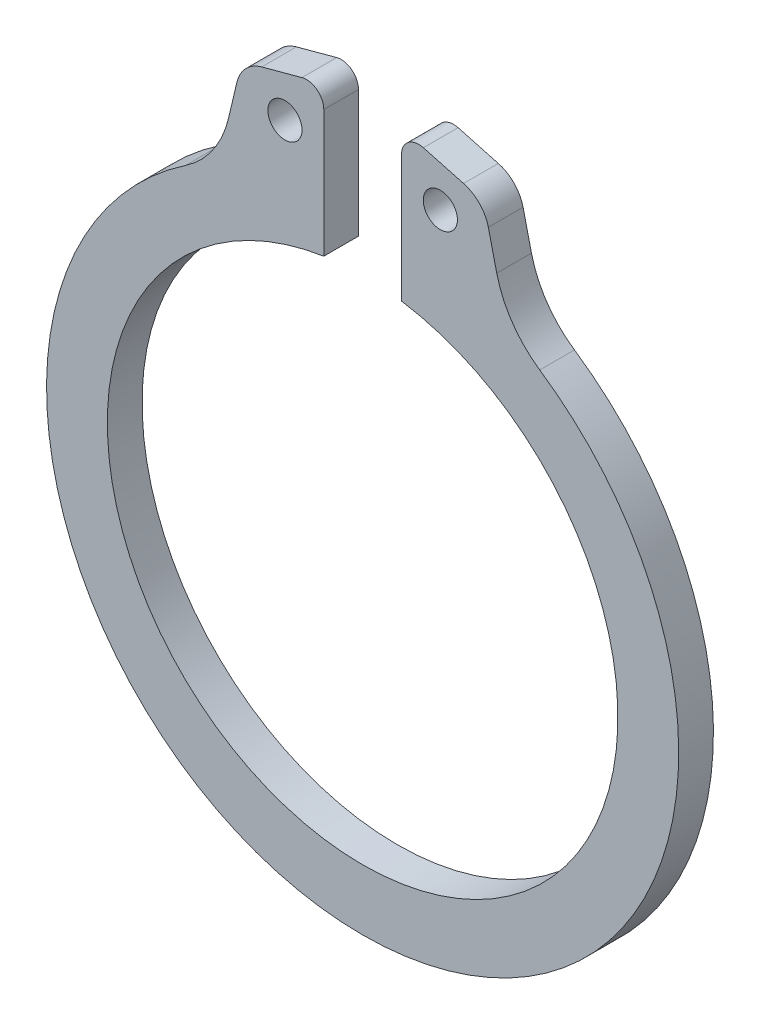
ISO-10303-21;
HEADER;
FILE_DESCRIPTION(('STEP AP214'),'2;1');
FILE_NAME('part.step','',(''),(''),'','','');
FILE_SCHEMA(('AUTOMOTIVE_DESIGN { 1 0 10303 214 1 1 1 1 }'));
ENDSEC;
DATA;
#1=APPLICATION_CONTEXT('core data for automotive mechanical design processes');
#2=APPLICATION_PROTOCOL_DEFINITION('international standard','automotive_design',2000,#1);
#3=PRODUCT_CONTEXT('',#1,'mechanical');
#4=PRODUCT('Part','Part','',(#3));
#5=PRODUCT_RELATED_PRODUCT_CATEGORY('part','',(#4));
#6=PRODUCT_DEFINITION_FORMATION('','',#4);
#7=PRODUCT_DEFINITION_CONTEXT('part definition',#1,'design');
#8=PRODUCT_DEFINITION('design','',#6,#7);
#9=PRODUCT_DEFINITION_SHAPE('','',#8);
#10=(LENGTH_UNIT() NAMED_UNIT(*) SI_UNIT(.MILLI.,.METRE.));
#11=(NAMED_UNIT(*) PLANE_ANGLE_UNIT() SI_UNIT($,.RADIAN.));
#12=(NAMED_UNIT(*) SI_UNIT($,.STERADIAN.) SOLID_ANGLE_UNIT());
#13=UNCERTAINTY_MEASURE_WITH_UNIT(LENGTH_MEASURE(1.E-05),#10,'distance_accuracy_value','');
#14=(GEOMETRIC_REPRESENTATION_CONTEXT(3) GLOBAL_UNCERTAINTY_ASSIGNED_CONTEXT((#13)) GLOBAL_UNIT_ASSIGNED_CONTEXT((#10,
#11,#12)) REPRESENTATION_CONTEXT('',''));
#15=CARTESIAN_POINT('',(0.,0.,0.));
#16=DIRECTION('',(0.,0.,1.));
#17=DIRECTION('',(1.,0.,0.));
#18=AXIS2_PLACEMENT_3D('',#15,#16,#17);
#19=CARTESIAN_POINT('',(6.78045818482251,10.021745696428,1.));
#20=DIRECTION('',(0.,0.,-1.));
#21=DIRECTION('',(-1.,0.,0.));
#22=AXIS2_PLACEMENT_3D('',#19,#20,#21);
#23=PLANE('',#22);
#24=CARTESIAN_POINT('',(6.78045818482251,10.021745696428,1.));
#25=DIRECTION('',(0.,0.,-1.));
#26=DIRECTION('',(-1.,0.,0.));
#27=AXIS2_PLACEMENT_3D('',#24,#25,#26);
#28=CIRCLE('',#27,3.);
#29=CARTESIAN_POINT('',(5.09935284974255,7.53701535847066,1.));
#30=VERTEX_POINT('',#29);
#31=CARTESIAN_POINT('',(3.86104743509331,9.33106423991885,1.));
#32=VERTEX_POINT('',#31);
#33=EDGE_CURVE('E199',#30,#32,#28,.T.);
#34=ORIENTED_EDGE('',*,*,#33,.T.);
#35=DIRECTION('',(-0.230227152169722,0.973136916576398,0.));
#36=VECTOR('',#35,1.);
#37=CARTESIAN_POINT('',(3.6188177346436,10.3549341943414,1.));
#38=LINE('',#37,#36);
#39=CARTESIAN_POINT('',(3.6188177346436,10.3549341943414,1.));
#40=VERTEX_POINT('',#39);
#41=EDGE_CURVE('E113',#32,#40,#38,.T.);
#42=ORIENTED_EDGE('',*,*,#41,.T.);
#43=CARTESIAN_POINT('',(2.6456808180672,10.1247070421717,1.));
#44=DIRECTION('',(0.,0.,1.));
#45=DIRECTION('',(1.,0.,0.));
#46=AXIS2_PLACEMENT_3D('',#43,#44,#45);
#47=CIRCLE('',#46,1.);
#48=CARTESIAN_POINT('',(2.90650426318065,11.0900935608673,1.));
#49=VERTEX_POINT('',#48);
#50=EDGE_CURVE('E232',#40,#49,#47,.T.);
#51=ORIENTED_EDGE('',*,*,#50,.T.);
#52=DIRECTION('',(-0.965386518695568,0.260823445113455,0.));
#53=VECTOR('',#52,1.);
#54=CARTESIAN_POINT('',(2.23684537066101,11.2710187509495,1.));
#55=LINE('',#54,#53);
#56=CARTESIAN_POINT('',(1.74883440788723,11.4028671848139,1.));
#57=VERTEX_POINT('',#56);
#58=EDGE_CURVE('E249',#49,#57,#55,.T.);
#59=ORIENTED_EDGE('',*,*,#58,.T.);
#60=CARTESIAN_POINT('',(1.6184226853305,10.9201739254661,1.));
#61=DIRECTION('',(0.,0.,1.));
#62=DIRECTION('',(-1.,0.,0.));
#63=AXIS2_PLACEMENT_3D('',#60,#61,#62);
#64=CIRCLE('',#63,0.5);
#65=CARTESIAN_POINT('',(1.1184226853305,10.9201739254661,1.));
#66=VERTEX_POINT('',#65);
#67=EDGE_CURVE('E246',#57,#66,#64,.T.);
#68=ORIENTED_EDGE('',*,*,#67,.T.);
#69=DIRECTION('',(0.,-1.,0.));
#70=VECTOR('',#69,1.);
#71=CARTESIAN_POINT('',(1.1184226853305,10.9201739254661,1.));
#72=LINE('',#71,#70);
#73=CARTESIAN_POINT('',(1.1184226853305,7.26440848912959,1.));
#74=VERTEX_POINT('',#73);
#75=EDGE_CURVE('E248',#66,#74,#72,.T.);
#76=ORIENTED_EDGE('',*,*,#75,.T.);
#77=CARTESIAN_POINT('',(0.,0.,1.));
#78=DIRECTION('',(0.,0.,-1.));
#79=DIRECTION('',(1.,0.,0.));
#80=AXIS2_PLACEMENT_3D('',#77,#78,#79);
#81=CIRCLE('',#80,7.35);
#82=CARTESIAN_POINT('',(-1.1184226853305,7.26440848912959,1.));
#83=VERTEX_POINT('',#82);
#84=EDGE_CURVE('E251',#74,#83,#81,.T.);
#85=ORIENTED_EDGE('',*,*,#84,.T.);
#86=DIRECTION('',(0.,1.,0.));
#87=VECTOR('',#86,1.);
#88=CARTESIAN_POINT('',(-1.1184226853305,9.03100939524138,1.));
#89=LINE('',#88,#87);
#90=CARTESIAN_POINT('',(-1.1184226853305,10.9201739254661,1.));
#91=VERTEX_POINT('',#90);
#92=EDGE_CURVE('E257',#83,#91,#89,.T.);
#93=ORIENTED_EDGE('',*,*,#92,.T.);
#94=CARTESIAN_POINT('',(-1.6184226853305,10.9201739254661,1.));
#95=DIRECTION('',(0.,0.,1.));
#96=DIRECTION('',(1.,0.,0.));
#97=AXIS2_PLACEMENT_3D('',#94,#95,#96);
#98=CIRCLE('',#97,0.5);
#99=CARTESIAN_POINT('',(-1.74883440788723,11.4028671848139,1.));
#100=VERTEX_POINT('',#99);
#101=EDGE_CURVE('E259',#91,#100,#98,.T.);
#102=ORIENTED_EDGE('',*,*,#101,.T.);
#103=DIRECTION('',(-0.965386518695568,-0.260823445113454,0.));
#104=VECTOR('',#103,1.);
#105=CARTESIAN_POINT('',(-1.74883440788723,11.4028671848139,1.));
#106=LINE('',#105,#104);
#107=CARTESIAN_POINT('',(-2.90650426318065,11.0900935608673,1.));
#108=VERTEX_POINT('',#107);
#109=EDGE_CURVE('E261',#100,#108,#106,.T.);
#110=ORIENTED_EDGE('',*,*,#109,.T.);
#111=CARTESIAN_POINT('',(-2.6456808180672,10.1247070421717,1.));
#112=DIRECTION('',(0.,0.,1.));
#113=DIRECTION('',(1.,0.,0.));
#114=AXIS2_PLACEMENT_3D('',#111,#112,#113);
#115=CIRCLE('',#114,1.);
#116=CARTESIAN_POINT('',(-3.6188177346436,10.3549341943414,1.));
#117=VERTEX_POINT('',#116);
#118=EDGE_CURVE('E150',#108,#117,#115,.T.);
#119=ORIENTED_EDGE('',*,*,#118,.T.);
#120=DIRECTION('',(-0.230227152169722,-0.973136916576398,0.));
#121=VECTOR('',#120,1.);
#122=CARTESIAN_POINT('',(-3.6188177346436,10.3549341943414,1.));
#123=LINE('',#122,#121);
#124=CARTESIAN_POINT('',(-3.86104743509331,9.33106423991885,1.));
#125=VERTEX_POINT('',#124);
#126=EDGE_CURVE('E144',#117,#125,#123,.T.);
#127=ORIENTED_EDGE('',*,*,#126,.T.);
#128=CARTESIAN_POINT('',(-6.78045818482251,10.021745696428,1.));
#129=DIRECTION('',(0.,0.,-1.));
#130=DIRECTION('',(1.,0.,0.));
#131=AXIS2_PLACEMENT_3D('',#128,#129,#130);
#132=CIRCLE('',#131,3.);
#133=CARTESIAN_POINT('',(-5.09935284974255,7.53701535847066,1.));
#134=VERTEX_POINT('',#133);
#135=EDGE_CURVE('E148',#125,#134,#132,.T.);
#136=ORIENTED_EDGE('',*,*,#135,.T.);
#137=CARTESIAN_POINT('',(0.,0.,1.));
#138=DIRECTION('',(0.,0.,1.));
#139=DIRECTION('',(1.,0.,0.));
#140=AXIS2_PLACEMENT_3D('',#137,#138,#139);
#141=CIRCLE('',#140,9.1);
#142=EDGE_CURVE('E52',#134,#30,#141,.T.);
#143=ORIENTED_EDGE('',*,*,#142,.T.);
#144=EDGE_LOOP('',(#34,#42,#51,#59,#68,#76,#85,#93,#102,#110,#119,#127,#136,#143));
#145=FACE_BOUND('',#144,.T.);
#146=CARTESIAN_POINT('',(2.23684537066101,10.0959344006117,1.));
#147=DIRECTION('',(0.,0.,1.));
#148=DIRECTION('',(1.,0.,0.));
#149=AXIS2_PLACEMENT_3D('',#146,#147,#148);
#150=CIRCLE('',#149,0.491728838169198);
#151=CARTESIAN_POINT('',(2.72857420883021,10.0959344006117,1.));
#152=VERTEX_POINT('',#151);
#153=EDGE_CURVE('E172',#152,#152,#150,.T.);
#154=ORIENTED_EDGE('',*,*,#153,.F.);
#155=EDGE_LOOP('',(#154));
#156=FACE_BOUND('',#155,.T.);
#157=CARTESIAN_POINT('',(-2.23684537066101,10.0959344006117,1.));
#158=DIRECTION('',(0.,0.,1.));
#159=DIRECTION('',(-1.,0.,0.));
#160=AXIS2_PLACEMENT_3D('',#157,#158,#159);
#161=CIRCLE('',#160,0.491728838169198);
#162=CARTESIAN_POINT('',(-2.72857420883021,10.0959344006117,1.));
#163=VERTEX_POINT('',#162);
#164=EDGE_CURVE('E301',#163,#163,#161,.T.);
#165=ORIENTED_EDGE('',*,*,#164,.F.);
#166=EDGE_LOOP('',(#165));
#167=FACE_BOUND('',#166,.T.);
#168=ADVANCED_FACE('F35',(#145,#156,#167),#23,.F.);
#169=CARTESIAN_POINT('',(6.78045818482251,10.021745696428,0.));
#170=DIRECTION('',(0.,0.,-1.));
#171=DIRECTION('',(-1.,0.,0.));
#172=AXIS2_PLACEMENT_3D('',#169,#170,#171);
#173=PLANE('',#172);
#174=CARTESIAN_POINT('',(2.23684537066101,10.0959344006117,0.));
#175=DIRECTION('',(0.,0.,1.));
#176=DIRECTION('',(1.,0.,0.));
#177=AXIS2_PLACEMENT_3D('',#174,#175,#176);
#178=CIRCLE('',#177,0.491728838169198);
#179=CARTESIAN_POINT('',(2.72857420883021,10.0959344006117,0.));
#180=VERTEX_POINT('',#179);
#181=EDGE_CURVE('E306',#180,#180,#178,.T.);
#182=ORIENTED_EDGE('',*,*,#181,.T.);
#183=EDGE_LOOP('',(#182));
#184=FACE_BOUND('',#183,.T.);
#185=CARTESIAN_POINT('',(6.78045818482251,10.021745696428,0.));
#186=DIRECTION('',(0.,0.,-1.));
#187=DIRECTION('',(-1.,0.,0.));
#188=AXIS2_PLACEMENT_3D('',#185,#186,#187);
#189=CIRCLE('',#188,3.);
#190=CARTESIAN_POINT('',(5.09935284974255,7.53701535847066,0.));
#191=VERTEX_POINT('',#190);
#192=CARTESIAN_POINT('',(3.86104743509331,9.33106423991885,0.));
#193=VERTEX_POINT('',#192);
#194=EDGE_CURVE('E168',#191,#193,#189,.T.);
#195=ORIENTED_EDGE('',*,*,#194,.F.);
#196=CARTESIAN_POINT('',(0.,0.,0.));
#197=DIRECTION('',(0.,0.,1.));
#198=DIRECTION('',(1.,0.,0.));
#199=AXIS2_PLACEMENT_3D('',#196,#197,#198);
#200=CIRCLE('',#199,9.1);
#201=CARTESIAN_POINT('',(-5.09935284974255,7.53701535847066,0.));
#202=VERTEX_POINT('',#201);
#203=EDGE_CURVE('E105',#202,#191,#200,.T.);
#204=ORIENTED_EDGE('',*,*,#203,.F.);
#205=CARTESIAN_POINT('',(-6.78045818482251,10.021745696428,0.));
#206=DIRECTION('',(0.,0.,-1.));
#207=DIRECTION('',(1.,0.,0.));
#208=AXIS2_PLACEMENT_3D('',#205,#206,#207);
#209=CIRCLE('',#208,3.);
#210=CARTESIAN_POINT('',(-3.86104743509331,9.33106423991885,0.));
#211=VERTEX_POINT('',#210);
#212=EDGE_CURVE('E99',#211,#202,#209,.T.);
#213=ORIENTED_EDGE('',*,*,#212,.F.);
#214=DIRECTION('',(-0.230227152169722,-0.973136916576398,0.));
#215=VECTOR('',#214,1.);
#216=CARTESIAN_POINT('',(-3.6188177346436,10.3549341943414,0.));
#217=LINE('',#216,#215);
#218=CARTESIAN_POINT('',(-3.6188177346436,10.3549341943414,0.));
#219=VERTEX_POINT('',#218);
#220=EDGE_CURVE('E158',#219,#211,#217,.T.);
#221=ORIENTED_EDGE('',*,*,#220,.F.);
#222=CARTESIAN_POINT('',(-2.6456808180672,10.1247070421717,0.));
#223=DIRECTION('',(0.,0.,1.));
#224=DIRECTION('',(1.,0.,0.));
#225=AXIS2_PLACEMENT_3D('',#222,#223,#224);
#226=CIRCLE('',#225,1.);
#227=CARTESIAN_POINT('',(-2.90650426318065,11.0900935608673,0.));
#228=VERTEX_POINT('',#227);
#229=EDGE_CURVE('E194',#228,#219,#226,.T.);
#230=ORIENTED_EDGE('',*,*,#229,.F.);
#231=DIRECTION('',(-0.965386518695568,-0.260823445113455,0.));
#232=VECTOR('',#231,1.);
#233=CARTESIAN_POINT('',(-2.23684537066101,11.2710187509495,0.));
#234=LINE('',#233,#232);
#235=CARTESIAN_POINT('',(-1.74883440788723,11.4028671848139,0.));
#236=VERTEX_POINT('',#235);
#237=EDGE_CURVE('E192',#236,#228,#234,.T.);
#238=ORIENTED_EDGE('',*,*,#237,.F.);
#239=CARTESIAN_POINT('',(-1.6184226853305,10.9201739254661,0.));
#240=DIRECTION('',(0.,0.,1.));
#241=DIRECTION('',(1.,0.,0.));
#242=AXIS2_PLACEMENT_3D('',#239,#240,#241);
#243=CIRCLE('',#242,0.5);
#244=CARTESIAN_POINT('',(-1.1184226853305,10.9201739254661,0.));
#245=VERTEX_POINT('',#244);
#246=EDGE_CURVE('E189',#245,#236,#243,.T.);
#247=ORIENTED_EDGE('',*,*,#246,.F.);
#248=DIRECTION('',(0.,1.,0.));
#249=VECTOR('',#248,1.);
#250=CARTESIAN_POINT('',(-1.1184226853305,10.9201739254661,0.));
#251=LINE('',#250,#249);
#252=CARTESIAN_POINT('',(-1.1184226853305,7.26440848912959,0.));
#253=VERTEX_POINT('',#252);
#254=EDGE_CURVE('E187',#253,#245,#251,.T.);
#255=ORIENTED_EDGE('',*,*,#254,.F.);
#256=CARTESIAN_POINT('',(0.,0.,0.));
#257=DIRECTION('',(0.,0.,-1.));
#258=DIRECTION('',(1.,0.,0.));
#259=AXIS2_PLACEMENT_3D('',#256,#257,#258);
#260=CIRCLE('',#259,7.35);
#261=CARTESIAN_POINT('',(1.1184226853305,7.26440848912959,0.));
#262=VERTEX_POINT('',#261);
#263=EDGE_CURVE('E184',#262,#253,#260,.T.);
#264=ORIENTED_EDGE('',*,*,#263,.F.);
#265=DIRECTION('',(0.,-1.,0.));
#266=VECTOR('',#265,1.);
#267=CARTESIAN_POINT('',(1.1184226853305,9.03100939524138,0.));
#268=LINE('',#267,#266);
#269=CARTESIAN_POINT('',(1.1184226853305,10.9201739254661,0.));
#270=VERTEX_POINT('',#269);
#271=EDGE_CURVE('E182',#270,#262,#268,.T.);
#272=ORIENTED_EDGE('',*,*,#271,.F.);
#273=CARTESIAN_POINT('',(1.6184226853305,10.9201739254661,0.));
#274=DIRECTION('',(0.,0.,1.));
#275=DIRECTION('',(-1.,0.,0.));
#276=AXIS2_PLACEMENT_3D('',#273,#274,#275);
#277=CIRCLE('',#276,0.5);
#278=CARTESIAN_POINT('',(1.74883440788723,11.4028671848139,0.));
#279=VERTEX_POINT('',#278);
#280=EDGE_CURVE('E179',#279,#270,#277,.T.);
#281=ORIENTED_EDGE('',*,*,#280,.F.);
#282=DIRECTION('',(-0.965386518695568,0.260823445113454,0.));
#283=VECTOR('',#282,1.);
#284=CARTESIAN_POINT('',(1.74883440788723,11.4028671848139,0.));
#285=LINE('',#284,#283);
#286=CARTESIAN_POINT('',(2.90650426318065,11.0900935608673,0.));
#287=VERTEX_POINT('',#286);
#288=EDGE_CURVE('E177',#287,#279,#285,.T.);
#289=ORIENTED_EDGE('',*,*,#288,.F.);
#290=CARTESIAN_POINT('',(2.6456808180672,10.1247070421717,0.));
#291=DIRECTION('',(0.,0.,1.));
#292=DIRECTION('',(1.,0.,0.));
#293=AXIS2_PLACEMENT_3D('',#290,#291,#292);
#294=CIRCLE('',#293,1.);
#295=CARTESIAN_POINT('',(3.6188177346436,10.3549341943414,0.));
#296=VERTEX_POINT('',#295);
#297=EDGE_CURVE('E174',#296,#287,#294,.T.);
#298=ORIENTED_EDGE('',*,*,#297,.F.);
#299=DIRECTION('',(-0.230227152169722,0.973136916576398,0.));
#300=VECTOR('',#299,1.);
#301=CARTESIAN_POINT('',(3.6188177346436,10.3549341943414,0.));
#302=LINE('',#301,#300);
#303=EDGE_CURVE('E171',#193,#296,#302,.T.);
#304=ORIENTED_EDGE('',*,*,#303,.F.);
#305=EDGE_LOOP('',(#195,#204,#213,#221,#230,#238,#247,#255,#264,#272,#281,#289,#298,#304));
#306=FACE_BOUND('',#305,.T.);
#307=CARTESIAN_POINT('',(-2.23684537066101,10.0959344006117,0.));
#308=DIRECTION('',(0.,0.,1.));
#309=DIRECTION('',(-1.,0.,0.));
#310=AXIS2_PLACEMENT_3D('',#307,#308,#309);
#311=CIRCLE('',#310,0.491728838169198);
#312=CARTESIAN_POINT('',(-2.72857420883021,10.0959344006117,0.));
#313=VERTEX_POINT('',#312);
#314=EDGE_CURVE('E304',#313,#313,#311,.T.);
#315=ORIENTED_EDGE('',*,*,#314,.T.);
#316=EDGE_LOOP('',(#315));
#317=FACE_BOUND('',#316,.T.);
#318=ADVANCED_FACE('F235',(#184,#306,#317),#173,.T.);
#319=CARTESIAN_POINT('',(6.78045818482251,10.021745696428,1.));
#320=DIRECTION('',(0.,0.,-1.));
#321=DIRECTION('',(-1.,0.,0.));
#322=AXIS2_PLACEMENT_3D('',#319,#320,#321);
#323=CYLINDRICAL_SURFACE('',#322,3.);
#324=ORIENTED_EDGE('',*,*,#194,.T.);
#325=DIRECTION('',(0.,0.,-1.));
#326=VECTOR('',#325,1.);
#327=CARTESIAN_POINT('',(3.86104743509331,9.33106423991885,1.));
#328=LINE('',#327,#326);
#329=EDGE_CURVE('E11',#32,#193,#328,.T.);
#330=ORIENTED_EDGE('',*,*,#329,.F.);
#331=ORIENTED_EDGE('',*,*,#33,.F.);
#332=DIRECTION('',(0.,0.,-1.));
#333=VECTOR('',#332,1.);
#334=CARTESIAN_POINT('',(5.09935284974255,7.53701535847066,1.));
#335=LINE('',#334,#333);
#336=EDGE_CURVE('E164',#30,#191,#335,.T.);
#337=ORIENTED_EDGE('',*,*,#336,.T.);
#338=EDGE_LOOP('',(#324,#330,#331,#337));
#339=FACE_BOUND('',#338,.T.);
#340=ADVANCED_FACE('F37',(#339),#323,.F.);
#341=CARTESIAN_POINT('',(3.6188177346436,10.3549341943414,1.));
#342=DIRECTION('',(-0.973136916576398,-0.230227152169722,0.));
#343=DIRECTION('',(0.230227152169722,-0.973136916576398,0.));
#344=AXIS2_PLACEMENT_3D('',#341,#342,#343);
#345=PLANE('',#344);
#346=ORIENTED_EDGE('',*,*,#303,.T.);
#347=DIRECTION('',(0.,0.,-1.));
#348=VECTOR('',#347,1.);
#349=CARTESIAN_POINT('',(3.6188177346436,10.3549341943414,1.));
#350=LINE('',#349,#348);
#351=EDGE_CURVE('E44',#40,#296,#350,.T.);
#352=ORIENTED_EDGE('',*,*,#351,.F.);
#353=ORIENTED_EDGE('',*,*,#41,.F.);
#354=ORIENTED_EDGE('',*,*,#329,.T.);
#355=EDGE_LOOP('',(#346,#352,#353,#354));
#356=FACE_BOUND('',#355,.T.);
#357=ADVANCED_FACE('F425',(#356),#345,.F.);
#358=CARTESIAN_POINT('',(2.6456808180672,10.1247070421717,1.));
#359=DIRECTION('',(0.,0.,-1.));
#360=DIRECTION('',(-1.,0.,0.));
#361=AXIS2_PLACEMENT_3D('',#358,#359,#360);
#362=CYLINDRICAL_SURFACE('',#361,1.);
#363=ORIENTED_EDGE('',*,*,#297,.T.);
#364=DIRECTION('',(0.,0.,-1.));
#365=VECTOR('',#364,1.);
#366=CARTESIAN_POINT('',(2.90650426318065,11.0900935608673,1.));
#367=LINE('',#366,#365);
#368=EDGE_CURVE('E224',#49,#287,#367,.T.);
#369=ORIENTED_EDGE('',*,*,#368,.F.);
#370=ORIENTED_EDGE('',*,*,#50,.F.);
#371=ORIENTED_EDGE('',*,*,#351,.T.);
#372=EDGE_LOOP('',(#363,#369,#370,#371));
#373=FACE_BOUND('',#372,.T.);
#374=ADVANCED_FACE('F230',(#373),#362,.T.);
#375=CARTESIAN_POINT('',(1.74883440788723,11.4028671848139,1.));
#376=DIRECTION('',(-0.260823445113454,-0.965386518695568,0.));
#377=DIRECTION('',(0.965386518695568,-0.260823445113454,0.));
#378=AXIS2_PLACEMENT_3D('',#375,#376,#377);
#379=PLANE('',#378);
#380=ORIENTED_EDGE('',*,*,#288,.T.);
#381=DIRECTION('',(0.,0.,-1.));
#382=VECTOR('',#381,1.);
#383=CARTESIAN_POINT('',(1.74883440788723,11.4028671848139,1.));
#384=LINE('',#383,#382);
#385=EDGE_CURVE('E221',#57,#279,#384,.T.);
#386=ORIENTED_EDGE('',*,*,#385,.F.);
#387=ORIENTED_EDGE('',*,*,#58,.F.);
#388=ORIENTED_EDGE('',*,*,#368,.T.);
#389=EDGE_LOOP('',(#380,#386,#387,#388));
#390=FACE_BOUND('',#389,.T.);
#391=ADVANCED_FACE('F240',(#390),#379,.F.);
#392=CARTESIAN_POINT('',(1.6184226853305,10.9201739254661,1.));
#393=DIRECTION('',(0.,0.,-1.));
#394=DIRECTION('',(-1.,0.,0.));
#395=AXIS2_PLACEMENT_3D('',#392,#393,#394);
#396=CYLINDRICAL_SURFACE('',#395,0.5);
#397=ORIENTED_EDGE('',*,*,#280,.T.);
#398=DIRECTION('',(0.,0.,-1.));
#399=VECTOR('',#398,1.);
#400=CARTESIAN_POINT('',(1.1184226853305,10.9201739254661,1.));
#401=LINE('',#400,#399);
#402=EDGE_CURVE('E218',#66,#270,#401,.T.);
#403=ORIENTED_EDGE('',*,*,#402,.F.);
#404=ORIENTED_EDGE('',*,*,#67,.F.);
#405=ORIENTED_EDGE('',*,*,#385,.T.);
#406=EDGE_LOOP('',(#397,#403,#404,#405));
#407=FACE_BOUND('',#406,.T.);
#408=ADVANCED_FACE('F244',(#407),#396,.T.);
#409=CARTESIAN_POINT('',(1.1184226853305,9.03100939524138,1.));
#410=DIRECTION('',(1.,0.,0.));
#411=DIRECTION('',(0.,0.,-1.));
#412=AXIS2_PLACEMENT_3D('',#409,#410,#411);
#413=PLANE('',#412);
#414=ORIENTED_EDGE('',*,*,#271,.T.);
#415=DIRECTION('',(0.,0.,-1.));
#416=VECTOR('',#415,1.);
#417=CARTESIAN_POINT('',(1.1184226853305,7.26440848912959,1.));
#418=LINE('',#417,#416);
#419=EDGE_CURVE('E215',#74,#262,#418,.T.);
#420=ORIENTED_EDGE('',*,*,#419,.F.);
#421=ORIENTED_EDGE('',*,*,#75,.F.);
#422=ORIENTED_EDGE('',*,*,#402,.T.);
#423=EDGE_LOOP('',(#414,#420,#421,#422));
#424=FACE_BOUND('',#423,.T.);
#425=ADVANCED_FACE('F388',(#424),#413,.F.);
#426=CARTESIAN_POINT('',(0.,0.,1.));
#427=DIRECTION('',(0.,0.,-1.));
#428=DIRECTION('',(-1.,0.,0.));
#429=AXIS2_PLACEMENT_3D('',#426,#427,#428);
#430=CYLINDRICAL_SURFACE('',#429,7.35);
#431=ORIENTED_EDGE('',*,*,#263,.T.);
#432=DIRECTION('',(0.,0.,-1.));
#433=VECTOR('',#432,1.);
#434=CARTESIAN_POINT('',(-1.1184226853305,7.26440848912959,1.));
#435=LINE('',#434,#433);
#436=EDGE_CURVE('E212',#83,#253,#435,.T.);
#437=ORIENTED_EDGE('',*,*,#436,.F.);
#438=ORIENTED_EDGE('',*,*,#84,.F.);
#439=ORIENTED_EDGE('',*,*,#419,.T.);
#440=EDGE_LOOP('',(#431,#437,#438,#439));
#441=FACE_BOUND('',#440,.T.);
#442=ADVANCED_FACE('F377',(#441),#430,.F.);
#443=CARTESIAN_POINT('',(-1.1184226853305,10.9201739254661,1.));
#444=DIRECTION('',(-1.,0.,0.));
#445=DIRECTION('',(0.,0.,1.));
#446=AXIS2_PLACEMENT_3D('',#443,#444,#445);
#447=PLANE('',#446);
#448=ORIENTED_EDGE('',*,*,#254,.T.);
#449=DIRECTION('',(0.,0.,-1.));
#450=VECTOR('',#449,1.);
#451=CARTESIAN_POINT('',(-1.1184226853305,10.9201739254661,1.));
#452=LINE('',#451,#450);
#453=EDGE_CURVE('E209',#91,#245,#452,.T.);
#454=ORIENTED_EDGE('',*,*,#453,.F.);
#455=ORIENTED_EDGE('',*,*,#92,.F.);
#456=ORIENTED_EDGE('',*,*,#436,.T.);
#457=EDGE_LOOP('',(#448,#454,#455,#456));
#458=FACE_BOUND('',#457,.T.);
#459=ADVANCED_FACE('F367',(#458),#447,.F.);
#460=CARTESIAN_POINT('',(-1.6184226853305,10.9201739254661,1.));
#461=DIRECTION('',(0.,0.,-1.));
#462=DIRECTION('',(-1.,0.,0.));
#463=AXIS2_PLACEMENT_3D('',#460,#461,#462);
#464=CYLINDRICAL_SURFACE('',#463,0.5);
#465=ORIENTED_EDGE('',*,*,#246,.T.);
#466=DIRECTION('',(0.,0.,-1.));
#467=VECTOR('',#466,1.);
#468=CARTESIAN_POINT('',(-1.74883440788723,11.4028671848139,1.));
#469=LINE('',#468,#467);
#470=EDGE_CURVE('E206',#100,#236,#469,.T.);
#471=ORIENTED_EDGE('',*,*,#470,.F.);
#472=ORIENTED_EDGE('',*,*,#101,.F.);
#473=ORIENTED_EDGE('',*,*,#453,.T.);
#474=EDGE_LOOP('',(#465,#471,#472,#473));
#475=FACE_BOUND('',#474,.T.);
#476=ADVANCED_FACE('F357',(#475),#464,.T.);
#477=CARTESIAN_POINT('',(-2.23684537066101,11.2710187509495,1.));
#478=DIRECTION('',(0.260823445113454,-0.965386518695568,0.));
#479=DIRECTION('',(0.965386518695568,0.260823445113455,0.));
#480=AXIS2_PLACEMENT_3D('',#477,#478,#479);
#481=PLANE('',#480);
#482=ORIENTED_EDGE('',*,*,#237,.T.);
#483=DIRECTION('',(0.,0.,-1.));
#484=VECTOR('',#483,1.);
#485=CARTESIAN_POINT('',(-2.90650426318065,11.0900935608673,1.));
#486=LINE('',#485,#484);
#487=EDGE_CURVE('E203',#108,#228,#486,.T.);
#488=ORIENTED_EDGE('',*,*,#487,.F.);
#489=ORIENTED_EDGE('',*,*,#109,.F.);
#490=ORIENTED_EDGE('',*,*,#470,.T.);
#491=EDGE_LOOP('',(#482,#488,#489,#490));
#492=FACE_BOUND('',#491,.T.);
#493=ADVANCED_FACE('F267',(#492),#481,.F.);
#494=CARTESIAN_POINT('',(-2.6456808180672,10.1247070421717,1.));
#495=DIRECTION('',(0.,0.,-1.));
#496=DIRECTION('',(-1.,0.,0.));
#497=AXIS2_PLACEMENT_3D('',#494,#495,#496);
#498=CYLINDRICAL_SURFACE('',#497,1.);
#499=ORIENTED_EDGE('',*,*,#229,.T.);
#500=DIRECTION('',(0.,0.,-1.));
#501=VECTOR('',#500,1.);
#502=CARTESIAN_POINT('',(-3.6188177346436,10.3549341943414,1.));
#503=LINE('',#502,#501);
#504=EDGE_CURVE('E159',#117,#219,#503,.T.);
#505=ORIENTED_EDGE('',*,*,#504,.F.);
#506=ORIENTED_EDGE('',*,*,#118,.F.);
#507=ORIENTED_EDGE('',*,*,#487,.T.);
#508=EDGE_LOOP('',(#499,#505,#506,#507));
#509=FACE_BOUND('',#508,.T.);
#510=ADVANCED_FACE('F270',(#509),#498,.T.);
#511=CARTESIAN_POINT('',(-3.6188177346436,10.3549341943414,1.));
#512=DIRECTION('',(0.973136916576398,-0.230227152169722,0.));
#513=DIRECTION('',(0.230227152169722,0.973136916576398,0.));
#514=AXIS2_PLACEMENT_3D('',#511,#512,#513);
#515=PLANE('',#514);
#516=ORIENTED_EDGE('',*,*,#220,.T.);
#517=DIRECTION('',(0.,0.,-1.));
#518=VECTOR('',#517,1.);
#519=CARTESIAN_POINT('',(-3.86104743509331,9.33106423991885,1.));
#520=LINE('',#519,#518);
#521=EDGE_CURVE('E155',#125,#211,#520,.T.);
#522=ORIENTED_EDGE('',*,*,#521,.F.);
#523=ORIENTED_EDGE('',*,*,#126,.F.);
#524=ORIENTED_EDGE('',*,*,#504,.T.);
#525=EDGE_LOOP('',(#516,#522,#523,#524));
#526=FACE_BOUND('',#525,.T.);
#527=ADVANCED_FACE('F156',(#526),#515,.F.);
#528=CARTESIAN_POINT('',(-6.78045818482251,10.021745696428,1.));
#529=DIRECTION('',(0.,0.,-1.));
#530=DIRECTION('',(-1.,0.,0.));
#531=AXIS2_PLACEMENT_3D('',#528,#529,#530);
#532=CYLINDRICAL_SURFACE('',#531,3.);
#533=ORIENTED_EDGE('',*,*,#212,.T.);
#534=DIRECTION('',(0.,0.,-1.));
#535=VECTOR('',#534,1.);
#536=CARTESIAN_POINT('',(-5.09935284974255,7.53701535847066,1.));
#537=LINE('',#536,#535);
#538=EDGE_CURVE('E160',#134,#202,#537,.T.);
#539=ORIENTED_EDGE('',*,*,#538,.F.);
#540=ORIENTED_EDGE('',*,*,#135,.F.);
#541=ORIENTED_EDGE('',*,*,#521,.T.);
#542=EDGE_LOOP('',(#533,#539,#540,#541));
#543=FACE_BOUND('',#542,.T.);
#544=ADVANCED_FACE('F162',(#543),#532,.F.);
#545=CARTESIAN_POINT('',(0.,0.,1.));
#546=DIRECTION('',(0.,0.,-1.));
#547=DIRECTION('',(-1.,0.,0.));
#548=AXIS2_PLACEMENT_3D('',#545,#546,#547);
#549=CYLINDRICAL_SURFACE('',#548,9.1);
#550=ORIENTED_EDGE('',*,*,#203,.T.);
#551=ORIENTED_EDGE('',*,*,#336,.F.);
#552=ORIENTED_EDGE('',*,*,#142,.F.);
#553=ORIENTED_EDGE('',*,*,#538,.T.);
#554=EDGE_LOOP('',(#550,#551,#552,#553));
#555=FACE_BOUND('',#554,.T.);
#556=ADVANCED_FACE('F274',(#555),#549,.T.);
#557=CARTESIAN_POINT('',(2.23684537066101,10.0959344006117,1.));
#558=DIRECTION('',(0.,0.,-1.));
#559=DIRECTION('',(-1.,0.,0.));
#560=AXIS2_PLACEMENT_3D('',#557,#558,#559);
#561=CYLINDRICAL_SURFACE('',#560,0.491728838169198);
#562=ORIENTED_EDGE('',*,*,#153,.T.);
#563=EDGE_LOOP('',(#562));
#564=FACE_BOUND('',#563,.T.);
#565=ORIENTED_EDGE('',*,*,#181,.F.);
#566=EDGE_LOOP('',(#565));
#567=FACE_BOUND('',#566,.T.);
#568=ADVANCED_FACE('F276',(#564,#567),#561,.F.);
#569=CARTESIAN_POINT('',(-2.23684537066101,10.0959344006117,1.));
#570=DIRECTION('',(0.,0.,-1.));
#571=DIRECTION('',(-1.,0.,0.));
#572=AXIS2_PLACEMENT_3D('',#569,#570,#571);
#573=CYLINDRICAL_SURFACE('',#572,0.491728838169198);
#574=ORIENTED_EDGE('',*,*,#164,.T.);
#575=EDGE_LOOP('',(#574));
#576=FACE_BOUND('',#575,.T.);
#577=ORIENTED_EDGE('',*,*,#314,.F.);
#578=EDGE_LOOP('',(#577));
#579=FACE_BOUND('',#578,.T.);
#580=ADVANCED_FACE('F282',(#576,#579),#573,.F.);
#581=CLOSED_SHELL('',(#168,#318,#340,#357,#374,#391,#408,#425,#442,#459,#476,#493,#510,#527,
#544,#556,#568,#580));
#582=MANIFOLD_SOLID_BREP('B2',#581);
#583=ADVANCED_BREP_SHAPE_REPRESENTATION('',(#18,#582),#14);
#584=SHAPE_DEFINITION_REPRESENTATION(#9,#583);
ENDSEC;
END-ISO-10303-21;
